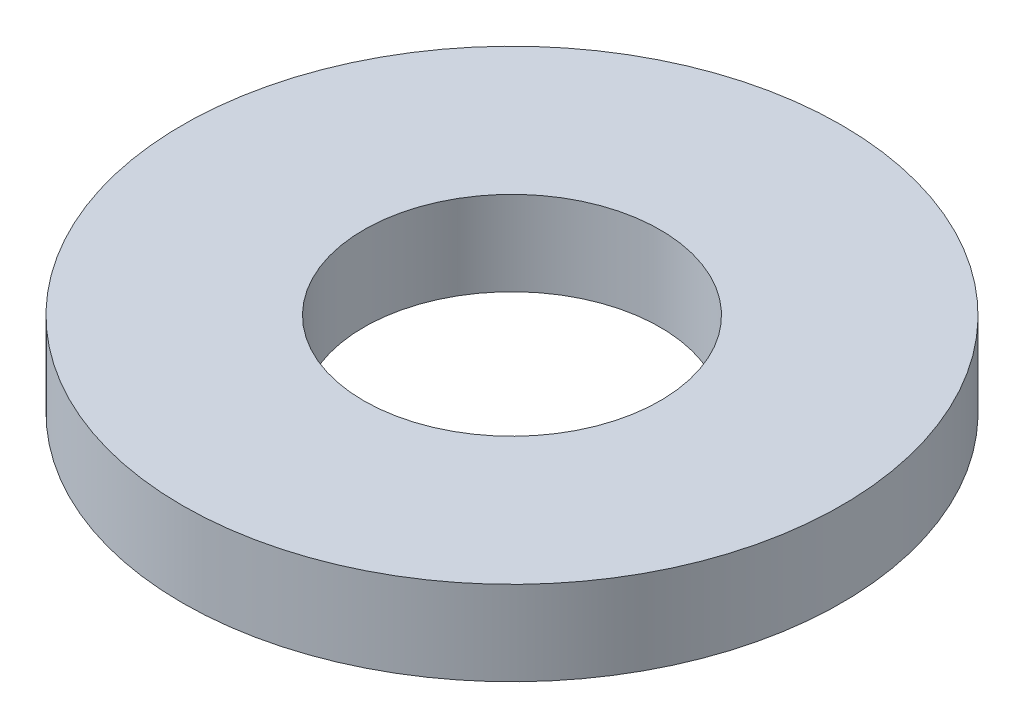
ISO-10303-21;
HEADER;
FILE_DESCRIPTION(('STEP AP214'),'2;1');
FILE_NAME('part.step','',(''),(''),'','','');
FILE_SCHEMA(('AUTOMOTIVE_DESIGN { 1 0 10303 214 1 1 1 1 }'));
ENDSEC;
DATA;
#1=APPLICATION_CONTEXT('core data for automotive mechanical design processes');
#2=APPLICATION_PROTOCOL_DEFINITION('international standard','automotive_design',2000,#1);
#3=PRODUCT_CONTEXT('',#1,'mechanical');
#4=PRODUCT('Part','Part','',(#3));
#5=PRODUCT_RELATED_PRODUCT_CATEGORY('part','',(#4));
#6=PRODUCT_DEFINITION_FORMATION('','',#4);
#7=PRODUCT_DEFINITION_CONTEXT('part definition',#1,'design');
#8=PRODUCT_DEFINITION('design','',#6,#7);
#9=PRODUCT_DEFINITION_SHAPE('','',#8);
#10=(LENGTH_UNIT() NAMED_UNIT(*) SI_UNIT(.MILLI.,.METRE.));
#11=(NAMED_UNIT(*) PLANE_ANGLE_UNIT() SI_UNIT($,.RADIAN.));
#12=(NAMED_UNIT(*) SI_UNIT($,.STERADIAN.) SOLID_ANGLE_UNIT());
#13=UNCERTAINTY_MEASURE_WITH_UNIT(LENGTH_MEASURE(1.E-05),#10,'distance_accuracy_value','');
#14=(GEOMETRIC_REPRESENTATION_CONTEXT(3) GLOBAL_UNCERTAINTY_ASSIGNED_CONTEXT((#13)) GLOBAL_UNIT_ASSIGNED_CONTEXT((#10,
#11,#12)) REPRESENTATION_CONTEXT('',''));
#15=CARTESIAN_POINT('',(0.,0.,0.));
#16=DIRECTION('',(0.,0.,1.));
#17=DIRECTION('',(1.,0.,0.));
#18=AXIS2_PLACEMENT_3D('',#15,#16,#17);
#19=CARTESIAN_POINT('',(3.5687,2.032,0.));
#20=DIRECTION('',(0.,1.,0.));
#21=DIRECTION('',(0.,0.,1.));
#22=AXIS2_PLACEMENT_3D('',#19,#20,#21);
#23=PLANE('',#22);
#24=CARTESIAN_POINT('',(0.,2.032,0.));
#25=DIRECTION('',(0.,1.,0.));
#26=DIRECTION('',(0.,0.,1.));
#27=AXIS2_PLACEMENT_3D('',#24,#25,#26);
#28=CIRCLE('',#27,7.9375);
#29=CARTESIAN_POINT('',(0.,2.032,7.9375));
#30=VERTEX_POINT('',#29);
#31=EDGE_CURVE('E10',#30,#30,#28,.T.);
#32=ORIENTED_EDGE('',*,*,#31,.T.);
#33=EDGE_LOOP('',(#32));
#34=FACE_BOUND('',#33,.T.);
#35=CARTESIAN_POINT('',(0.,2.032,0.));
#36=DIRECTION('',(0.,1.,0.));
#37=DIRECTION('',(0.,0.,1.));
#38=AXIS2_PLACEMENT_3D('',#35,#36,#37);
#39=CIRCLE('',#38,3.5687);
#40=CARTESIAN_POINT('',(0.,2.032,3.5687));
#41=VERTEX_POINT('',#40);
#42=EDGE_CURVE('E45',#41,#41,#39,.T.);
#43=ORIENTED_EDGE('',*,*,#42,.F.);
#44=EDGE_LOOP('',(#43));
#45=FACE_BOUND('',#44,.T.);
#46=ADVANCED_FACE('F31',(#34,#45),#23,.T.);
#47=CARTESIAN_POINT('',(0.,0.,0.));
#48=DIRECTION('',(0.,1.,0.));
#49=DIRECTION('',(0.,0.,1.));
#50=AXIS2_PLACEMENT_3D('',#47,#48,#49);
#51=CYLINDRICAL_SURFACE('',#50,7.9375);
#52=CARTESIAN_POINT('',(0.,0.,0.));
#53=DIRECTION('',(0.,1.,0.));
#54=DIRECTION('',(0.,0.,1.));
#55=AXIS2_PLACEMENT_3D('',#52,#53,#54);
#56=CIRCLE('',#55,7.9375);
#57=CARTESIAN_POINT('',(0.,0.,7.9375));
#58=VERTEX_POINT('',#57);
#59=EDGE_CURVE('E37',#58,#58,#56,.T.);
#60=ORIENTED_EDGE('',*,*,#59,.T.);
#61=EDGE_LOOP('',(#60));
#62=FACE_BOUND('',#61,.T.);
#63=ORIENTED_EDGE('',*,*,#31,.F.);
#64=EDGE_LOOP('',(#63));
#65=FACE_BOUND('',#64,.T.);
#66=ADVANCED_FACE('F55',(#62,#65),#51,.T.);
#67=CARTESIAN_POINT('',(7.9375,0.,0.));
#68=DIRECTION('',(0.,-1.,0.));
#69=DIRECTION('',(0.,0.,-1.));
#70=AXIS2_PLACEMENT_3D('',#67,#68,#69);
#71=PLANE('',#70);
#72=CARTESIAN_POINT('',(0.,0.,0.));
#73=DIRECTION('',(0.,1.,0.));
#74=DIRECTION('',(0.,0.,1.));
#75=AXIS2_PLACEMENT_3D('',#72,#73,#74);
#76=CIRCLE('',#75,3.5687);
#77=CARTESIAN_POINT('',(0.,0.,3.5687));
#78=VERTEX_POINT('',#77);
#79=EDGE_CURVE('E41',#78,#78,#76,.T.);
#80=ORIENTED_EDGE('',*,*,#79,.T.);
#81=EDGE_LOOP('',(#80));
#82=FACE_BOUND('',#81,.T.);
#83=ORIENTED_EDGE('',*,*,#59,.F.);
#84=EDGE_LOOP('',(#83));
#85=FACE_BOUND('',#84,.T.);
#86=ADVANCED_FACE('F59',(#82,#85),#71,.T.);
#87=CARTESIAN_POINT('',(0.,0.,0.));
#88=DIRECTION('',(0.,1.,0.));
#89=DIRECTION('',(0.,0.,1.));
#90=AXIS2_PLACEMENT_3D('',#87,#88,#89);
#91=CYLINDRICAL_SURFACE('',#90,3.5687);
#92=ORIENTED_EDGE('',*,*,#42,.T.);
#93=EDGE_LOOP('',(#92));
#94=FACE_BOUND('',#93,.T.);
#95=ORIENTED_EDGE('',*,*,#79,.F.);
#96=EDGE_LOOP('',(#95));
#97=FACE_BOUND('',#96,.T.);
#98=ADVANCED_FACE('F51',(#94,#97),#91,.F.);
#99=CLOSED_SHELL('',(#46,#66,#86,#98));
#100=MANIFOLD_SOLID_BREP('B2',#99);
#101=ADVANCED_BREP_SHAPE_REPRESENTATION('',(#18,#100),#14);
#102=SHAPE_DEFINITION_REPRESENTATION(#9,#101);
ENDSEC;
END-ISO-10303-21;
